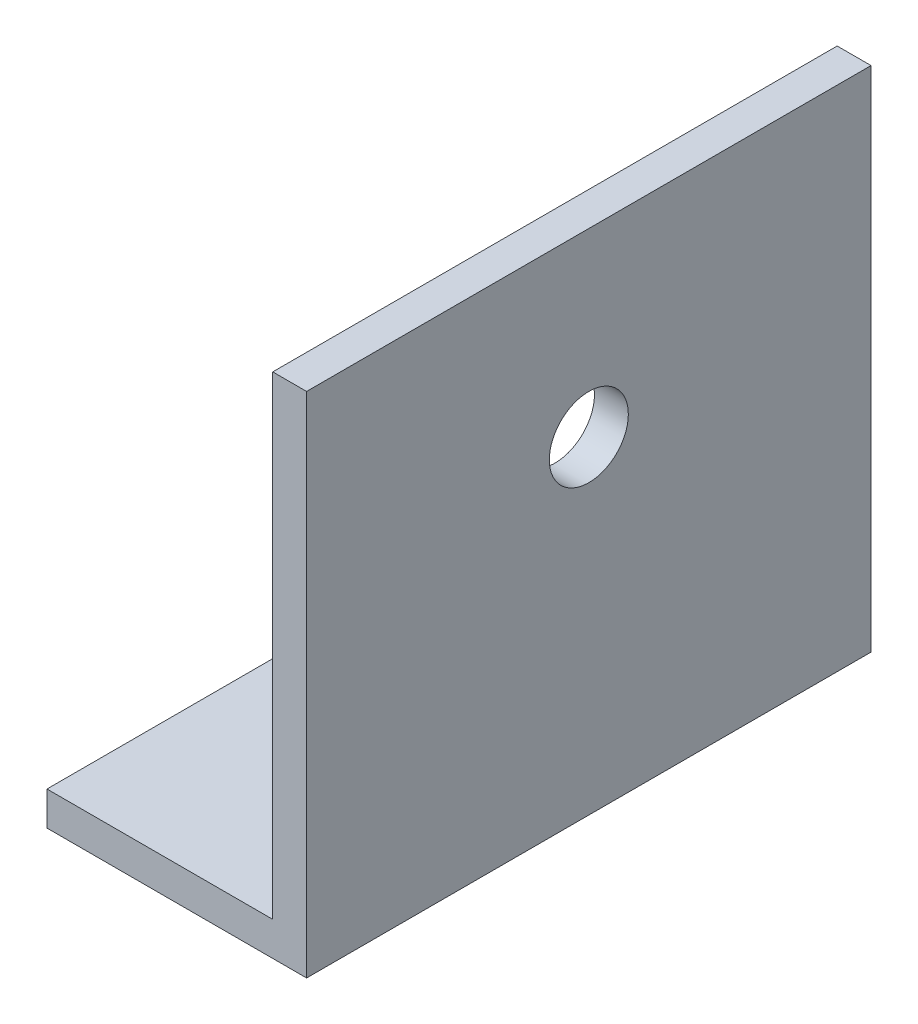
ISO-10303-21;
HEADER;
FILE_DESCRIPTION(('STEP AP214'),'2;1');
FILE_NAME('part.step','',(''),(''),'','','');
FILE_SCHEMA(('AUTOMOTIVE_DESIGN { 1 0 10303 214 1 1 1 1 }'));
ENDSEC;
DATA;
#1=APPLICATION_CONTEXT('core data for automotive mechanical design processes');
#2=APPLICATION_PROTOCOL_DEFINITION('international standard','automotive_design',2000,#1);
#3=PRODUCT_CONTEXT('',#1,'mechanical');
#4=PRODUCT('Part','Part','',(#3));
#5=PRODUCT_RELATED_PRODUCT_CATEGORY('part','',(#4));
#6=PRODUCT_DEFINITION_FORMATION('','',#4);
#7=PRODUCT_DEFINITION_CONTEXT('part definition',#1,'design');
#8=PRODUCT_DEFINITION('design','',#6,#7);
#9=PRODUCT_DEFINITION_SHAPE('','',#8);
#10=(LENGTH_UNIT() NAMED_UNIT(*) SI_UNIT(.MILLI.,.METRE.));
#11=(NAMED_UNIT(*) PLANE_ANGLE_UNIT() SI_UNIT($,.RADIAN.));
#12=(NAMED_UNIT(*) SI_UNIT($,.STERADIAN.) SOLID_ANGLE_UNIT());
#13=UNCERTAINTY_MEASURE_WITH_UNIT(LENGTH_MEASURE(1.E-05),#10,'distance_accuracy_value','');
#14=(GEOMETRIC_REPRESENTATION_CONTEXT(3) GLOBAL_UNCERTAINTY_ASSIGNED_CONTEXT((#13)) GLOBAL_UNIT_ASSIGNED_CONTEXT((#10,
#11,#12)) REPRESENTATION_CONTEXT('',''));
#15=CARTESIAN_POINT('',(0.,0.,0.));
#16=DIRECTION('',(0.,0.,1.));
#17=DIRECTION('',(1.,0.,0.));
#18=AXIS2_PLACEMENT_3D('',#15,#16,#17);
#19=CARTESIAN_POINT('',(-10.,3.,-25.));
#20=DIRECTION('',(0.,0.,1.));
#21=DIRECTION('',(1.,0.,0.));
#22=AXIS2_PLACEMENT_3D('',#19,#20,#21);
#23=PLANE('',#22);
#24=DIRECTION('',(-1.,0.,0.));
#25=VECTOR('',#24,1.);
#26=CARTESIAN_POINT('',(-10.,0.,-25.));
#27=LINE('',#26,#25);
#28=CARTESIAN_POINT('',(13.,0.,-25.));
#29=VERTEX_POINT('',#28);
#30=CARTESIAN_POINT('',(-10.,0.,-25.));
#31=VERTEX_POINT('',#30);
#32=EDGE_CURVE('E74',#29,#31,#27,.T.);
#33=ORIENTED_EDGE('',*,*,#32,.T.);
#34=DIRECTION('',(0.,-1.,0.));
#35=VECTOR('',#34,1.);
#36=CARTESIAN_POINT('',(-10.,3.,-25.));
#37=LINE('',#36,#35);
#38=CARTESIAN_POINT('',(-10.,3.,-25.));
#39=VERTEX_POINT('',#38);
#40=EDGE_CURVE('E11',#39,#31,#37,.T.);
#41=ORIENTED_EDGE('',*,*,#40,.F.);
#42=DIRECTION('',(-1.,0.,0.));
#43=VECTOR('',#42,1.);
#44=CARTESIAN_POINT('',(-10.,3.,-25.));
#45=LINE('',#44,#43);
#46=CARTESIAN_POINT('',(10.,3.,-25.));
#47=VERTEX_POINT('',#46);
#48=EDGE_CURVE('E104',#47,#39,#45,.T.);
#49=ORIENTED_EDGE('',*,*,#48,.F.);
#50=DIRECTION('',(0.,1.,0.));
#51=VECTOR('',#50,1.);
#52=CARTESIAN_POINT('',(10.,0.,-25.));
#53=LINE('',#52,#51);
#54=CARTESIAN_POINT('',(10.,45.,-25.));
#55=VERTEX_POINT('',#54);
#56=EDGE_CURVE('E93',#47,#55,#53,.T.);
#57=ORIENTED_EDGE('',*,*,#56,.T.);
#58=DIRECTION('',(-1.,0.,0.));
#59=VECTOR('',#58,1.);
#60=CARTESIAN_POINT('',(13.,45.,-25.));
#61=LINE('',#60,#59);
#62=CARTESIAN_POINT('',(13.,45.,-25.));
#63=VERTEX_POINT('',#62);
#64=EDGE_CURVE('E118',#63,#55,#61,.T.);
#65=ORIENTED_EDGE('',*,*,#64,.F.);
#66=DIRECTION('',(0.,1.,0.));
#67=VECTOR('',#66,1.);
#68=CARTESIAN_POINT('',(13.,0.,-25.));
#69=LINE('',#68,#67);
#70=EDGE_CURVE('E148',#29,#63,#69,.T.);
#71=ORIENTED_EDGE('',*,*,#70,.F.);
#72=EDGE_LOOP('',(#33,#41,#49,#57,#65,#71));
#73=FACE_BOUND('',#72,.T.);
#74=ADVANCED_FACE('F45',(#73),#23,.F.);
#75=CARTESIAN_POINT('',(-10.,3.,25.));
#76=DIRECTION('',(1.,0.,0.));
#77=DIRECTION('',(0.,0.,-1.));
#78=AXIS2_PLACEMENT_3D('',#75,#76,#77);
#79=PLANE('',#78);
#80=DIRECTION('',(0.,0.,1.));
#81=VECTOR('',#80,1.);
#82=CARTESIAN_POINT('',(-10.,0.,25.));
#83=LINE('',#82,#81);
#84=CARTESIAN_POINT('',(-10.,0.,25.));
#85=VERTEX_POINT('',#84);
#86=EDGE_CURVE('E115',#31,#85,#83,.T.);
#87=ORIENTED_EDGE('',*,*,#86,.T.);
#88=DIRECTION('',(0.,-1.,0.));
#89=VECTOR('',#88,1.);
#90=CARTESIAN_POINT('',(-10.,3.,25.));
#91=LINE('',#90,#89);
#92=CARTESIAN_POINT('',(-10.,3.,25.));
#93=VERTEX_POINT('',#92);
#94=EDGE_CURVE('E54',#93,#85,#91,.T.);
#95=ORIENTED_EDGE('',*,*,#94,.F.);
#96=DIRECTION('',(0.,0.,1.));
#97=VECTOR('',#96,1.);
#98=CARTESIAN_POINT('',(-10.,3.,25.));
#99=LINE('',#98,#97);
#100=EDGE_CURVE('E62',#39,#93,#99,.T.);
#101=ORIENTED_EDGE('',*,*,#100,.F.);
#102=ORIENTED_EDGE('',*,*,#40,.T.);
#103=EDGE_LOOP('',(#87,#95,#101,#102));
#104=FACE_BOUND('',#103,.T.);
#105=ADVANCED_FACE('F191',(#104),#79,.F.);
#106=CARTESIAN_POINT('',(-10.,3.,25.));
#107=DIRECTION('',(0.,0.,-1.));
#108=DIRECTION('',(-1.,0.,0.));
#109=AXIS2_PLACEMENT_3D('',#106,#107,#108);
#110=PLANE('',#109);
#111=DIRECTION('',(1.,0.,0.));
#112=VECTOR('',#111,1.);
#113=CARTESIAN_POINT('',(-10.,0.,25.));
#114=LINE('',#113,#112);
#115=CARTESIAN_POINT('',(13.,0.,25.));
#116=VERTEX_POINT('',#115);
#117=EDGE_CURVE('E111',#85,#116,#114,.T.);
#118=ORIENTED_EDGE('',*,*,#117,.T.);
#119=DIRECTION('',(0.,-1.,0.));
#120=VECTOR('',#119,1.);
#121=CARTESIAN_POINT('',(13.,0.,25.));
#122=LINE('',#121,#120);
#123=CARTESIAN_POINT('',(13.,45.,25.));
#124=VERTEX_POINT('',#123);
#125=EDGE_CURVE('E149',#124,#116,#122,.T.);
#126=ORIENTED_EDGE('',*,*,#125,.F.);
#127=DIRECTION('',(-1.,0.,0.));
#128=VECTOR('',#127,1.);
#129=CARTESIAN_POINT('',(13.,45.,25.));
#130=LINE('',#129,#128);
#131=CARTESIAN_POINT('',(10.,45.,25.));
#132=VERTEX_POINT('',#131);
#133=EDGE_CURVE('E169',#124,#132,#130,.T.);
#134=ORIENTED_EDGE('',*,*,#133,.T.);
#135=DIRECTION('',(0.,-1.,0.));
#136=VECTOR('',#135,1.);
#137=CARTESIAN_POINT('',(10.,0.,25.));
#138=LINE('',#137,#136);
#139=CARTESIAN_POINT('',(10.,3.,25.));
#140=VERTEX_POINT('',#139);
#141=EDGE_CURVE('E102',#132,#140,#138,.T.);
#142=ORIENTED_EDGE('',*,*,#141,.T.);
#143=DIRECTION('',(1.,0.,0.));
#144=VECTOR('',#143,1.);
#145=CARTESIAN_POINT('',(-10.,3.,25.));
#146=LINE('',#145,#144);
#147=EDGE_CURVE('E109',#93,#140,#146,.T.);
#148=ORIENTED_EDGE('',*,*,#147,.F.);
#149=ORIENTED_EDGE('',*,*,#94,.T.);
#150=EDGE_LOOP('',(#118,#126,#134,#142,#148,#149));
#151=FACE_BOUND('',#150,.T.);
#152=ADVANCED_FACE('F132',(#151),#110,.F.);
#153=CARTESIAN_POINT('',(0.,3.,0.));
#154=DIRECTION('',(0.,-1.,0.));
#155=DIRECTION('',(0.,0.,-1.));
#156=AXIS2_PLACEMENT_3D('',#153,#154,#155);
#157=PLANE('',#156);
#158=DIRECTION('',(0.,0.,-1.));
#159=VECTOR('',#158,1.);
#160=CARTESIAN_POINT('',(10.,3.,25.));
#161=LINE('',#160,#159);
#162=EDGE_CURVE('E83',#140,#47,#161,.T.);
#163=ORIENTED_EDGE('',*,*,#162,.T.);
#164=ORIENTED_EDGE('',*,*,#48,.T.);
#165=ORIENTED_EDGE('',*,*,#100,.T.);
#166=ORIENTED_EDGE('',*,*,#147,.T.);
#167=EDGE_LOOP('',(#163,#164,#165,#166));
#168=FACE_BOUND('',#167,.T.);
#169=ADVANCED_FACE('F107',(#168),#157,.F.);
#170=CARTESIAN_POINT('',(0.,0.,0.));
#171=DIRECTION('',(0.,-1.,0.));
#172=DIRECTION('',(0.,0.,-1.));
#173=AXIS2_PLACEMENT_3D('',#170,#171,#172);
#174=PLANE('',#173);
#175=ORIENTED_EDGE('',*,*,#32,.F.);
#176=DIRECTION('',(0.,0.,-1.));
#177=VECTOR('',#176,1.);
#178=CARTESIAN_POINT('',(13.,0.,25.));
#179=LINE('',#178,#177);
#180=EDGE_CURVE('E141',#116,#29,#179,.T.);
#181=ORIENTED_EDGE('',*,*,#180,.F.);
#182=ORIENTED_EDGE('',*,*,#117,.F.);
#183=ORIENTED_EDGE('',*,*,#86,.F.);
#184=EDGE_LOOP('',(#175,#181,#182,#183));
#185=FACE_BOUND('',#184,.T.);
#186=ADVANCED_FACE('F139',(#185),#174,.T.);
#187=CARTESIAN_POINT('',(10.,0.,0.));
#188=DIRECTION('',(-1.,0.,0.));
#189=DIRECTION('',(0.,0.,1.));
#190=AXIS2_PLACEMENT_3D('',#187,#188,#189);
#191=PLANE('',#190);
#192=CARTESIAN_POINT('',(10.,29.,0.));
#193=DIRECTION('',(1.,0.,0.));
#194=DIRECTION('',(0.,0.,-1.));
#195=AXIS2_PLACEMENT_3D('',#192,#193,#194);
#196=CIRCLE('',#195,3.5);
#197=CARTESIAN_POINT('',(10.,29.,-3.5));
#198=VERTEX_POINT('',#197);
#199=EDGE_CURVE('E162',#198,#198,#196,.T.);
#200=ORIENTED_EDGE('',*,*,#199,.T.);
#201=EDGE_LOOP('',(#200));
#202=FACE_BOUND('',#201,.T.);
#203=ORIENTED_EDGE('',*,*,#162,.F.);
#204=ORIENTED_EDGE('',*,*,#141,.F.);
#205=DIRECTION('',(0.,0.,1.));
#206=VECTOR('',#205,1.);
#207=CARTESIAN_POINT('',(10.,45.,25.));
#208=LINE('',#207,#206);
#209=EDGE_CURVE('E98',#55,#132,#208,.T.);
#210=ORIENTED_EDGE('',*,*,#209,.F.);
#211=ORIENTED_EDGE('',*,*,#56,.F.);
#212=EDGE_LOOP('',(#203,#204,#210,#211));
#213=FACE_BOUND('',#212,.T.);
#214=ADVANCED_FACE('F95',(#202,#213),#191,.T.);
#215=CARTESIAN_POINT('',(13.,0.,0.));
#216=DIRECTION('',(-1.,0.,0.));
#217=DIRECTION('',(0.,0.,1.));
#218=AXIS2_PLACEMENT_3D('',#215,#216,#217);
#219=PLANE('',#218);
#220=ORIENTED_EDGE('',*,*,#125,.T.);
#221=ORIENTED_EDGE('',*,*,#180,.T.);
#222=ORIENTED_EDGE('',*,*,#70,.T.);
#223=DIRECTION('',(0.,0.,1.));
#224=VECTOR('',#223,1.);
#225=CARTESIAN_POINT('',(13.,45.,25.));
#226=LINE('',#225,#224);
#227=EDGE_CURVE('E154',#63,#124,#226,.T.);
#228=ORIENTED_EDGE('',*,*,#227,.T.);
#229=EDGE_LOOP('',(#220,#221,#222,#228));
#230=FACE_BOUND('',#229,.T.);
#231=CARTESIAN_POINT('',(13.,29.,0.));
#232=DIRECTION('',(1.,0.,0.));
#233=DIRECTION('',(0.,0.,-1.));
#234=AXIS2_PLACEMENT_3D('',#231,#232,#233);
#235=CIRCLE('',#234,3.5);
#236=CARTESIAN_POINT('',(13.,29.,-3.5));
#237=VERTEX_POINT('',#236);
#238=EDGE_CURVE('E171',#237,#237,#235,.T.);
#239=ORIENTED_EDGE('',*,*,#238,.F.);
#240=EDGE_LOOP('',(#239));
#241=FACE_BOUND('',#240,.T.);
#242=ADVANCED_FACE('F151',(#230,#241),#219,.F.);
#243=CARTESIAN_POINT('',(13.,45.,25.));
#244=DIRECTION('',(0.,-1.,0.));
#245=DIRECTION('',(0.,0.,-1.));
#246=AXIS2_PLACEMENT_3D('',#243,#244,#245);
#247=PLANE('',#246);
#248=ORIENTED_EDGE('',*,*,#209,.T.);
#249=ORIENTED_EDGE('',*,*,#133,.F.);
#250=ORIENTED_EDGE('',*,*,#227,.F.);
#251=ORIENTED_EDGE('',*,*,#64,.T.);
#252=EDGE_LOOP('',(#248,#249,#250,#251));
#253=FACE_BOUND('',#252,.T.);
#254=ADVANCED_FACE('F175',(#253),#247,.F.);
#255=CARTESIAN_POINT('',(13.,29.,0.));
#256=DIRECTION('',(-1.,0.,0.));
#257=DIRECTION('',(0.,0.,1.));
#258=AXIS2_PLACEMENT_3D('',#255,#256,#257);
#259=CYLINDRICAL_SURFACE('',#258,3.5);
#260=ORIENTED_EDGE('',*,*,#238,.T.);
#261=EDGE_LOOP('',(#260));
#262=FACE_BOUND('',#261,.T.);
#263=ORIENTED_EDGE('',*,*,#199,.F.);
#264=EDGE_LOOP('',(#263));
#265=FACE_BOUND('',#264,.T.);
#266=ADVANCED_FACE('F179',(#262,#265),#259,.F.);
#267=CLOSED_SHELL('',(#74,#105,#152,#169,#186,#214,#242,#254,#266));
#268=MANIFOLD_SOLID_BREP('B2',#267);
#269=ADVANCED_BREP_SHAPE_REPRESENTATION('',(#18,#268),#14);
#270=SHAPE_DEFINITION_REPRESENTATION(#9,#269);
ENDSEC;
END-ISO-10303-21;
